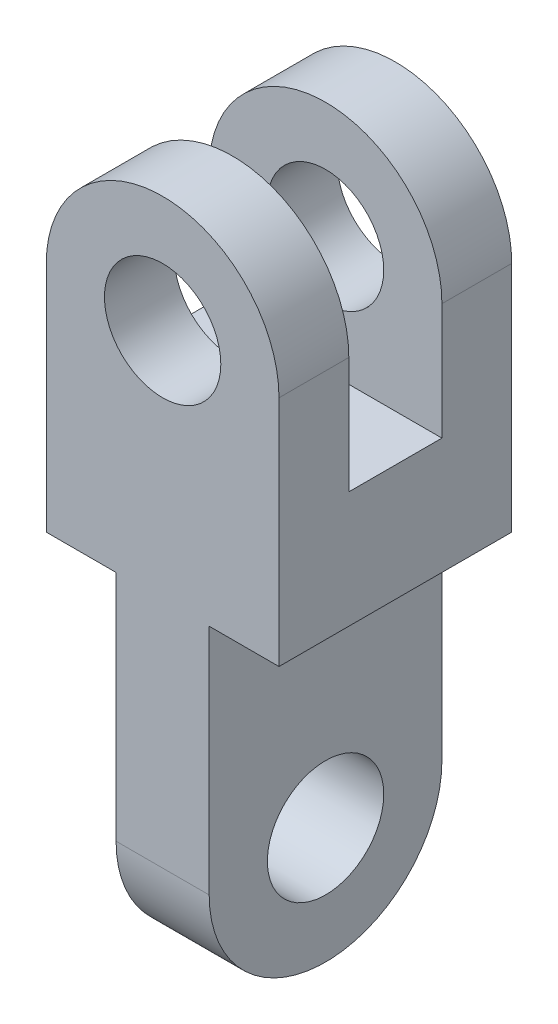
ISO-10303-21;
HEADER;
FILE_DESCRIPTION(('STEP AP214'),'2;1');
FILE_NAME('part.step','',(''),(''),'','','');
FILE_SCHEMA(('AUTOMOTIVE_DESIGN { 1 0 10303 214 1 1 1 1 }'));
ENDSEC;
DATA;
#1=APPLICATION_CONTEXT('core data for automotive mechanical design processes');
#2=APPLICATION_PROTOCOL_DEFINITION('international standard','automotive_design',2000,#1);
#3=PRODUCT_CONTEXT('',#1,'mechanical');
#4=PRODUCT('Part','Part','',(#3));
#5=PRODUCT_RELATED_PRODUCT_CATEGORY('part','',(#4));
#6=PRODUCT_DEFINITION_FORMATION('','',#4);
#7=PRODUCT_DEFINITION_CONTEXT('part definition',#1,'design');
#8=PRODUCT_DEFINITION('design','',#6,#7);
#9=PRODUCT_DEFINITION_SHAPE('','',#8);
#10=(LENGTH_UNIT() NAMED_UNIT(*) SI_UNIT(.MILLI.,.METRE.));
#11=(NAMED_UNIT(*) PLANE_ANGLE_UNIT() SI_UNIT($,.RADIAN.));
#12=(NAMED_UNIT(*) SI_UNIT($,.STERADIAN.) SOLID_ANGLE_UNIT());
#13=UNCERTAINTY_MEASURE_WITH_UNIT(LENGTH_MEASURE(1.E-05),#10,'distance_accuracy_value','');
#14=(GEOMETRIC_REPRESENTATION_CONTEXT(3) GLOBAL_UNCERTAINTY_ASSIGNED_CONTEXT((#13)) GLOBAL_UNIT_ASSIGNED_CONTEXT((#10,
#11,#12)) REPRESENTATION_CONTEXT('',''));
#15=CARTESIAN_POINT('',(0.,0.,0.));
#16=DIRECTION('',(0.,0.,1.));
#17=DIRECTION('',(1.,0.,0.));
#18=AXIS2_PLACEMENT_3D('',#15,#16,#17);
#19=CARTESIAN_POINT('',(40.,-91.739880304679,13.7281963801388));
#20=DIRECTION('',(1.,0.,0.));
#21=DIRECTION('',(0.,0.,-1.));
#22=AXIS2_PLACEMENT_3D('',#19,#20,#21);
#23=PLANE('',#22);
#24=DIRECTION('',(0.,-1.,0.));
#25=VECTOR('',#24,1.);
#26=CARTESIAN_POINT('',(40.,8.26011969532102,63.7281963801388));
#27=LINE('',#26,#25);
#28=CARTESIAN_POINT('',(40.,8.26011969532102,63.7281963801388));
#29=VERTEX_POINT('',#28);
#30=CARTESIAN_POINT('',(40.,-91.739880304679,63.7281963801388));
#31=VERTEX_POINT('',#30);
#32=EDGE_CURVE('E219',#29,#31,#27,.T.);
#33=ORIENTED_EDGE('',*,*,#32,.T.);
#34=CARTESIAN_POINT('',(40.,-91.739880304679,13.7281963801388));
#35=DIRECTION('',(1.,0.,0.));
#36=DIRECTION('',(0.,0.,-1.));
#37=AXIS2_PLACEMENT_3D('',#34,#35,#36);
#38=CIRCLE('',#37,50.);
#39=CARTESIAN_POINT('',(40.,-91.739880304679,-36.2718036198612));
#40=VERTEX_POINT('',#39);
#41=EDGE_CURVE('E222',#31,#40,#38,.T.);
#42=ORIENTED_EDGE('',*,*,#41,.T.);
#43=DIRECTION('',(0.,1.,0.));
#44=VECTOR('',#43,1.);
#45=CARTESIAN_POINT('',(40.,8.26011969532102,-36.2718036198612));
#46=LINE('',#45,#44);
#47=CARTESIAN_POINT('',(40.,8.26011969532102,-36.2718036198612));
#48=VERTEX_POINT('',#47);
#49=EDGE_CURVE('E225',#40,#48,#46,.T.);
#50=ORIENTED_EDGE('',*,*,#49,.T.);
#51=DIRECTION('',(0.,0.,1.));
#52=VECTOR('',#51,1.);
#53=CARTESIAN_POINT('',(40.,8.26011969532102,63.7281963801388));
#54=LINE('',#53,#52);
#55=EDGE_CURVE('E227',#48,#29,#54,.T.);
#56=ORIENTED_EDGE('',*,*,#55,.T.);
#57=EDGE_LOOP('',(#33,#42,#50,#56));
#58=FACE_BOUND('',#57,.T.);
#59=CARTESIAN_POINT('',(40.,-91.739880304679,13.7281963801388));
#60=DIRECTION('',(1.,0.,0.));
#61=DIRECTION('',(0.,0.,-1.));
#62=AXIS2_PLACEMENT_3D('',#59,#60,#61);
#63=CIRCLE('',#62,25.);
#64=CARTESIAN_POINT('',(40.,-91.739880304679,-11.2718036198612));
#65=VERTEX_POINT('',#64);
#66=EDGE_CURVE('E213',#65,#65,#63,.T.);
#67=ORIENTED_EDGE('',*,*,#66,.F.);
#68=EDGE_LOOP('',(#67));
#69=FACE_BOUND('',#68,.T.);
#70=ADVANCED_FACE('F39',(#58,#69),#23,.T.);
#71=CARTESIAN_POINT('',(0.,-91.739880304679,13.7281963801388));
#72=DIRECTION('',(1.,0.,0.));
#73=DIRECTION('',(0.,0.,-1.));
#74=AXIS2_PLACEMENT_3D('',#71,#72,#73);
#75=PLANE('',#74);
#76=DIRECTION('',(0.,-1.,0.));
#77=VECTOR('',#76,1.);
#78=CARTESIAN_POINT('',(0.,8.26011969532102,63.7281963801388));
#79=LINE('',#78,#77);
#80=CARTESIAN_POINT('',(0.,8.26011969532102,63.7281963801388));
#81=VERTEX_POINT('',#80);
#82=CARTESIAN_POINT('',(0.,-91.739880304679,63.7281963801388));
#83=VERTEX_POINT('',#82);
#84=EDGE_CURVE('E216',#81,#83,#79,.T.);
#85=ORIENTED_EDGE('',*,*,#84,.F.);
#86=DIRECTION('',(0.,0.,1.));
#87=VECTOR('',#86,1.);
#88=CARTESIAN_POINT('',(0.,8.26011969532102,63.7281963801388));
#89=LINE('',#88,#87);
#90=CARTESIAN_POINT('',(0.,8.26011969532101,-36.2718036198612));
#91=VERTEX_POINT('',#90);
#92=EDGE_CURVE('E223',#91,#81,#89,.T.);
#93=ORIENTED_EDGE('',*,*,#92,.F.);
#94=DIRECTION('',(0.,1.,0.));
#95=VECTOR('',#94,1.);
#96=CARTESIAN_POINT('',(0.,8.26011969532102,-36.2718036198612));
#97=LINE('',#96,#95);
#98=CARTESIAN_POINT('',(0.,-91.739880304679,-36.2718036198612));
#99=VERTEX_POINT('',#98);
#100=EDGE_CURVE('E233',#99,#91,#97,.T.);
#101=ORIENTED_EDGE('',*,*,#100,.F.);
#102=CARTESIAN_POINT('',(0.,-91.739880304679,13.7281963801388));
#103=DIRECTION('',(1.,0.,0.));
#104=DIRECTION('',(0.,0.,-1.));
#105=AXIS2_PLACEMENT_3D('',#102,#103,#104);
#106=CIRCLE('',#105,50.);
#107=EDGE_CURVE('E231',#83,#99,#106,.T.);
#108=ORIENTED_EDGE('',*,*,#107,.F.);
#109=EDGE_LOOP('',(#85,#93,#101,#108));
#110=FACE_BOUND('',#109,.T.);
#111=CARTESIAN_POINT('',(0.,-91.739880304679,13.7281963801388));
#112=DIRECTION('',(1.,0.,0.));
#113=DIRECTION('',(0.,0.,-1.));
#114=AXIS2_PLACEMENT_3D('',#111,#112,#113);
#115=CIRCLE('',#114,25.);
#116=CARTESIAN_POINT('',(0.,-91.739880304679,-11.2718036198612));
#117=VERTEX_POINT('',#116);
#118=EDGE_CURVE('E206',#117,#117,#115,.T.);
#119=ORIENTED_EDGE('',*,*,#118,.T.);
#120=EDGE_LOOP('',(#119));
#121=FACE_BOUND('',#120,.T.);
#122=ADVANCED_FACE('F248',(#110,#121),#75,.F.);
#123=CARTESIAN_POINT('',(40.,8.26011969532102,63.7281963801388));
#124=DIRECTION('',(0.,0.,-1.));
#125=DIRECTION('',(-1.,0.,0.));
#126=AXIS2_PLACEMENT_3D('',#123,#124,#125);
#127=PLANE('',#126);
#128=ORIENTED_EDGE('',*,*,#84,.T.);
#129=DIRECTION('',(-1.,0.,0.));
#130=VECTOR('',#129,1.);
#131=CARTESIAN_POINT('',(40.,-91.739880304679,63.7281963801388));
#132=LINE('',#131,#130);
#133=EDGE_CURVE('E11',#31,#83,#132,.T.);
#134=ORIENTED_EDGE('',*,*,#133,.F.);
#135=ORIENTED_EDGE('',*,*,#32,.F.);
#136=DIRECTION('',(-1.,0.,0.));
#137=VECTOR('',#136,1.);
#138=CARTESIAN_POINT('',(0.,8.26011969532101,63.7281963801388));
#139=LINE('',#138,#137);
#140=CARTESIAN_POINT('',(70.,8.26011969532101,63.7281963801388));
#141=VERTEX_POINT('',#140);
#142=EDGE_CURVE('E182',#141,#29,#139,.T.);
#143=ORIENTED_EDGE('',*,*,#142,.F.);
#144=DIRECTION('',(0.,1.,0.));
#145=VECTOR('',#144,1.);
#146=CARTESIAN_POINT('',(70.,0.,63.7281963801388));
#147=LINE('',#146,#145);
#148=CARTESIAN_POINT('',(70.,108.260119695321,63.7281963801388));
#149=VERTEX_POINT('',#148);
#150=EDGE_CURVE('E192',#141,#149,#147,.T.);
#151=ORIENTED_EDGE('',*,*,#150,.T.);
#152=CARTESIAN_POINT('',(20.,108.260119695321,63.7281963801388));
#153=DIRECTION('',(0.,0.,1.));
#154=DIRECTION('',(1.,0.,0.));
#155=AXIS2_PLACEMENT_3D('',#152,#153,#154);
#156=CIRCLE('',#155,50.);
#157=CARTESIAN_POINT('',(-30.,108.260119695321,63.7281963801388));
#158=VERTEX_POINT('',#157);
#159=EDGE_CURVE('E195',#149,#158,#156,.T.);
#160=ORIENTED_EDGE('',*,*,#159,.T.);
#161=DIRECTION('',(0.,-1.,0.));
#162=VECTOR('',#161,1.);
#163=CARTESIAN_POINT('',(-30.,0.,63.7281963801388));
#164=LINE('',#163,#162);
#165=CARTESIAN_POINT('',(-30.,8.26011969532101,63.7281963801388));
#166=VERTEX_POINT('',#165);
#167=EDGE_CURVE('E198',#158,#166,#164,.T.);
#168=ORIENTED_EDGE('',*,*,#167,.T.);
#169=EDGE_CURVE('E201',#81,#166,#139,.T.);
#170=ORIENTED_EDGE('',*,*,#169,.F.);
#171=EDGE_LOOP('',(#128,#134,#135,#143,#151,#160,#168,#170));
#172=FACE_BOUND('',#171,.T.);
#173=CARTESIAN_POINT('',(20.,108.260119695321,63.7281963801388));
#174=DIRECTION('',(0.,0.,1.));
#175=DIRECTION('',(1.,0.,0.));
#176=AXIS2_PLACEMENT_3D('',#173,#174,#175);
#177=CIRCLE('',#176,25.);
#178=CARTESIAN_POINT('',(45.,108.260119695321,63.7281963801388));
#179=VERTEX_POINT('',#178);
#180=EDGE_CURVE('E176',#179,#179,#177,.T.);
#181=ORIENTED_EDGE('',*,*,#180,.F.);
#182=EDGE_LOOP('',(#181));
#183=FACE_BOUND('',#182,.T.);
#184=ADVANCED_FACE('F41',(#172,#183),#127,.F.);
#185=CARTESIAN_POINT('',(40.,-91.739880304679,13.7281963801388));
#186=DIRECTION('',(-1.,0.,0.));
#187=DIRECTION('',(0.,0.,1.));
#188=AXIS2_PLACEMENT_3D('',#185,#186,#187);
#189=CYLINDRICAL_SURFACE('',#188,50.);
#190=ORIENTED_EDGE('',*,*,#107,.T.);
#191=DIRECTION('',(-1.,0.,0.));
#192=VECTOR('',#191,1.);
#193=CARTESIAN_POINT('',(40.,-91.739880304679,-36.2718036198612));
#194=LINE('',#193,#192);
#195=EDGE_CURVE('E47',#40,#99,#194,.T.);
#196=ORIENTED_EDGE('',*,*,#195,.F.);
#197=ORIENTED_EDGE('',*,*,#41,.F.);
#198=ORIENTED_EDGE('',*,*,#133,.T.);
#199=EDGE_LOOP('',(#190,#196,#197,#198));
#200=FACE_BOUND('',#199,.T.);
#201=ADVANCED_FACE('F272',(#200),#189,.T.);
#202=CARTESIAN_POINT('',(40.,8.26011969532102,-36.2718036198612));
#203=DIRECTION('',(0.,0.,1.));
#204=DIRECTION('',(0.,-1.,0.));
#205=AXIS2_PLACEMENT_3D('',#202,#203,#204);
#206=PLANE('',#205);
#207=ORIENTED_EDGE('',*,*,#100,.T.);
#208=DIRECTION('',(-1.,0.,0.));
#209=VECTOR('',#208,1.);
#210=CARTESIAN_POINT('',(0.,8.26011969532101,-36.2718036198612));
#211=LINE('',#210,#209);
#212=CARTESIAN_POINT('',(-30.,8.26011969532101,-36.2718036198612));
#213=VERTEX_POINT('',#212);
#214=EDGE_CURVE('E167',#91,#213,#211,.T.);
#215=ORIENTED_EDGE('',*,*,#214,.T.);
#216=DIRECTION('',(0.,-1.,0.));
#217=VECTOR('',#216,1.);
#218=CARTESIAN_POINT('',(-30.,0.,-36.2718036198612));
#219=LINE('',#218,#217);
#220=CARTESIAN_POINT('',(-30.,108.260119695321,-36.2718036198612));
#221=VERTEX_POINT('',#220);
#222=EDGE_CURVE('E171',#221,#213,#219,.T.);
#223=ORIENTED_EDGE('',*,*,#222,.F.);
#224=CARTESIAN_POINT('',(20.,108.260119695321,-36.2718036198612));
#225=DIRECTION('',(0.,0.,1.));
#226=DIRECTION('',(1.,0.,0.));
#227=AXIS2_PLACEMENT_3D('',#224,#225,#226);
#228=CIRCLE('',#227,50.);
#229=CARTESIAN_POINT('',(70.,108.260119695321,-36.2718036198612));
#230=VERTEX_POINT('',#229);
#231=EDGE_CURVE('E157',#230,#221,#228,.T.);
#232=ORIENTED_EDGE('',*,*,#231,.F.);
#233=DIRECTION('',(0.,1.,0.));
#234=VECTOR('',#233,1.);
#235=CARTESIAN_POINT('',(70.,0.,-36.2718036198612));
#236=LINE('',#235,#234);
#237=CARTESIAN_POINT('',(70.,8.26011969532101,-36.2718036198612));
#238=VERTEX_POINT('',#237);
#239=EDGE_CURVE('E165',#238,#230,#236,.T.);
#240=ORIENTED_EDGE('',*,*,#239,.F.);
#241=EDGE_CURVE('E168',#238,#48,#211,.T.);
#242=ORIENTED_EDGE('',*,*,#241,.T.);
#243=ORIENTED_EDGE('',*,*,#49,.F.);
#244=ORIENTED_EDGE('',*,*,#195,.T.);
#245=EDGE_LOOP('',(#207,#215,#223,#232,#240,#242,#243,#244));
#246=FACE_BOUND('',#245,.T.);
#247=CARTESIAN_POINT('',(20.,108.260119695321,-36.2718036198612));
#248=DIRECTION('',(0.,0.,1.));
#249=DIRECTION('',(1.,0.,0.));
#250=AXIS2_PLACEMENT_3D('',#247,#248,#249);
#251=CIRCLE('',#250,25.);
#252=CARTESIAN_POINT('',(45.,108.260119695321,-36.2718036198612));
#253=VERTEX_POINT('',#252);
#254=EDGE_CURVE('E154',#253,#253,#251,.T.);
#255=ORIENTED_EDGE('',*,*,#254,.T.);
#256=EDGE_LOOP('',(#255));
#257=FACE_BOUND('',#256,.T.);
#258=ADVANCED_FACE('F241',(#246,#257),#206,.F.);
#259=CARTESIAN_POINT('',(40.,-91.739880304679,13.7281963801388));
#260=DIRECTION('',(-1.,0.,0.));
#261=DIRECTION('',(0.,0.,1.));
#262=AXIS2_PLACEMENT_3D('',#259,#260,#261);
#263=CYLINDRICAL_SURFACE('',#262,25.);
#264=ORIENTED_EDGE('',*,*,#66,.T.);
#265=EDGE_LOOP('',(#264));
#266=FACE_BOUND('',#265,.T.);
#267=ORIENTED_EDGE('',*,*,#118,.F.);
#268=EDGE_LOOP('',(#267));
#269=FACE_BOUND('',#268,.T.);
#270=ADVANCED_FACE('F278',(#266,#269),#263,.F.);
#271=CARTESIAN_POINT('',(0.,8.26011969532101,33.7281963801388));
#272=DIRECTION('',(0.,1.,0.));
#273=DIRECTION('',(-1.,0.,0.));
#274=AXIS2_PLACEMENT_3D('',#271,#272,#273);
#275=PLANE('',#274);
#276=DIRECTION('',(0.,0.,1.));
#277=VECTOR('',#276,1.);
#278=CARTESIAN_POINT('',(-30.,8.26011969532101,33.7281963801388));
#279=LINE('',#278,#277);
#280=EDGE_CURVE('E207',#213,#166,#279,.T.);
#281=ORIENTED_EDGE('',*,*,#280,.F.);
#282=ORIENTED_EDGE('',*,*,#214,.F.);
#283=ORIENTED_EDGE('',*,*,#92,.T.);
#284=ORIENTED_EDGE('',*,*,#169,.T.);
#285=EDGE_LOOP('',(#281,#282,#283,#284));
#286=FACE_BOUND('',#285,.T.);
#287=ADVANCED_FACE('F252',(#286),#275,.F.);
#288=CARTESIAN_POINT('',(70.,0.,33.7281963801388));
#289=DIRECTION('',(1.,0.,0.));
#290=DIRECTION('',(0.,0.,-1.));
#291=AXIS2_PLACEMENT_3D('',#288,#289,#290);
#292=PLANE('',#291);
#293=ORIENTED_EDGE('',*,*,#150,.F.);
#294=DIRECTION('',(0.,0.,1.));
#295=VECTOR('',#294,1.);
#296=CARTESIAN_POINT('',(70.,8.26011969532101,33.7281963801388));
#297=LINE('',#296,#295);
#298=EDGE_CURVE('E204',#238,#141,#297,.T.);
#299=ORIENTED_EDGE('',*,*,#298,.F.);
#300=ORIENTED_EDGE('',*,*,#239,.T.);
#301=DIRECTION('',(0.,0.,-1.));
#302=VECTOR('',#301,1.);
#303=CARTESIAN_POINT('',(70.,108.260119695321,-6.27180361986121));
#304=LINE('',#303,#302);
#305=CARTESIAN_POINT('',(70.,108.260119695321,-6.27180361986121));
#306=VERTEX_POINT('',#305);
#307=EDGE_CURVE('E135',#306,#230,#304,.T.);
#308=ORIENTED_EDGE('',*,*,#307,.F.);
#309=DIRECTION('',(0.,1.,0.));
#310=VECTOR('',#309,1.);
#311=CARTESIAN_POINT('',(70.,0.,-6.27180361986121));
#312=LINE('',#311,#310);
#313=CARTESIAN_POINT('',(70.,58.260119695321,-6.27180361986121));
#314=VERTEX_POINT('',#313);
#315=EDGE_CURVE('E127',#314,#306,#312,.T.);
#316=ORIENTED_EDGE('',*,*,#315,.F.);
#317=DIRECTION('',(0.,0.,1.));
#318=VECTOR('',#317,1.);
#319=CARTESIAN_POINT('',(70.,58.260119695321,33.7281963801388));
#320=LINE('',#319,#318);
#321=CARTESIAN_POINT('',(70.,58.260119695321,33.7281963801388));
#322=VERTEX_POINT('',#321);
#323=EDGE_CURVE('E132',#314,#322,#320,.T.);
#324=ORIENTED_EDGE('',*,*,#323,.T.);
#325=DIRECTION('',(0.,1.,0.));
#326=VECTOR('',#325,1.);
#327=CARTESIAN_POINT('',(70.,0.,33.7281963801388));
#328=LINE('',#327,#326);
#329=CARTESIAN_POINT('',(70.,108.260119695321,33.7281963801388));
#330=VERTEX_POINT('',#329);
#331=EDGE_CURVE('E59',#322,#330,#328,.T.);
#332=ORIENTED_EDGE('',*,*,#331,.T.);
#333=DIRECTION('',(0.,0.,1.));
#334=VECTOR('',#333,1.);
#335=CARTESIAN_POINT('',(70.,108.260119695321,33.7281963801388));
#336=LINE('',#335,#334);
#337=EDGE_CURVE('E189',#330,#149,#336,.T.);
#338=ORIENTED_EDGE('',*,*,#337,.T.);
#339=EDGE_LOOP('',(#293,#299,#300,#308,#316,#324,#332,#338));
#340=FACE_BOUND('',#339,.T.);
#341=ADVANCED_FACE('F130',(#340),#292,.T.);
#342=ORIENTED_EDGE('',*,*,#142,.T.);
#343=ORIENTED_EDGE('',*,*,#55,.F.);
#344=ORIENTED_EDGE('',*,*,#241,.F.);
#345=ORIENTED_EDGE('',*,*,#298,.T.);
#346=EDGE_LOOP('',(#342,#343,#344,#345));
#347=FACE_BOUND('',#346,.T.);
#348=ADVANCED_FACE('F264',(#347),#275,.F.);
#349=CARTESIAN_POINT('',(-30.,0.,33.7281963801388));
#350=DIRECTION('',(-1.,0.,0.));
#351=DIRECTION('',(0.,0.,1.));
#352=AXIS2_PLACEMENT_3D('',#349,#350,#351);
#353=PLANE('',#352);
#354=ORIENTED_EDGE('',*,*,#167,.F.);
#355=DIRECTION('',(0.,0.,1.));
#356=VECTOR('',#355,1.);
#357=CARTESIAN_POINT('',(-30.,108.260119695321,33.7281963801388));
#358=LINE('',#357,#356);
#359=CARTESIAN_POINT('',(-30.,108.260119695321,33.7281963801388));
#360=VERTEX_POINT('',#359);
#361=EDGE_CURVE('E210',#360,#158,#358,.T.);
#362=ORIENTED_EDGE('',*,*,#361,.F.);
#363=DIRECTION('',(0.,-1.,0.));
#364=VECTOR('',#363,1.);
#365=CARTESIAN_POINT('',(-30.,0.,33.7281963801388));
#366=LINE('',#365,#364);
#367=CARTESIAN_POINT('',(-30.,58.260119695321,33.7281963801388));
#368=VERTEX_POINT('',#367);
#369=EDGE_CURVE('E187',#360,#368,#366,.T.);
#370=ORIENTED_EDGE('',*,*,#369,.T.);
#371=DIRECTION('',(0.,0.,1.));
#372=VECTOR('',#371,1.);
#373=CARTESIAN_POINT('',(-30.,58.260119695321,33.7281963801388));
#374=LINE('',#373,#372);
#375=CARTESIAN_POINT('',(-30.,58.260119695321,-6.27180361986121));
#376=VERTEX_POINT('',#375);
#377=EDGE_CURVE('E148',#376,#368,#374,.T.);
#378=ORIENTED_EDGE('',*,*,#377,.F.);
#379=DIRECTION('',(0.,-1.,0.));
#380=VECTOR('',#379,1.);
#381=CARTESIAN_POINT('',(-30.,0.,-6.27180361986121));
#382=LINE('',#381,#380);
#383=CARTESIAN_POINT('',(-30.,108.260119695321,-6.27180361986121));
#384=VERTEX_POINT('',#383);
#385=EDGE_CURVE('E138',#384,#376,#382,.T.);
#386=ORIENTED_EDGE('',*,*,#385,.F.);
#387=DIRECTION('',(0.,0.,-1.));
#388=VECTOR('',#387,1.);
#389=CARTESIAN_POINT('',(-30.,108.260119695321,-6.27180361986121));
#390=LINE('',#389,#388);
#391=EDGE_CURVE('E162',#384,#221,#390,.T.);
#392=ORIENTED_EDGE('',*,*,#391,.T.);
#393=ORIENTED_EDGE('',*,*,#222,.T.);
#394=ORIENTED_EDGE('',*,*,#280,.T.);
#395=EDGE_LOOP('',(#354,#362,#370,#378,#386,#392,#393,#394));
#396=FACE_BOUND('',#395,.T.);
#397=ADVANCED_FACE('F256',(#396),#353,.T.);
#398=CARTESIAN_POINT('',(20.,108.260119695321,33.7281963801388));
#399=DIRECTION('',(0.,0.,1.));
#400=DIRECTION('',(1.,0.,0.));
#401=AXIS2_PLACEMENT_3D('',#398,#399,#400);
#402=CYLINDRICAL_SURFACE('',#401,25.);
#403=CARTESIAN_POINT('',(20.,108.260119695321,33.7281963801388));
#404=DIRECTION('',(0.,0.,1.));
#405=DIRECTION('',(1.,0.,0.));
#406=AXIS2_PLACEMENT_3D('',#403,#404,#405);
#407=CIRCLE('',#406,25.);
#408=CARTESIAN_POINT('',(45.,108.260119695321,33.7281963801388));
#409=VERTEX_POINT('',#408);
#410=EDGE_CURVE('E179',#409,#409,#407,.T.);
#411=ORIENTED_EDGE('',*,*,#410,.F.);
#412=EDGE_LOOP('',(#411));
#413=FACE_BOUND('',#412,.T.);
#414=ORIENTED_EDGE('',*,*,#180,.T.);
#415=EDGE_LOOP('',(#414));
#416=FACE_BOUND('',#415,.T.);
#417=ADVANCED_FACE('F290',(#413,#416),#402,.F.);
#418=CARTESIAN_POINT('',(20.,108.260119695321,33.7281963801388));
#419=DIRECTION('',(0.,0.,1.));
#420=DIRECTION('',(1.,0.,0.));
#421=AXIS2_PLACEMENT_3D('',#418,#419,#420);
#422=CYLINDRICAL_SURFACE('',#421,50.);
#423=ORIENTED_EDGE('',*,*,#159,.F.);
#424=ORIENTED_EDGE('',*,*,#337,.F.);
#425=CARTESIAN_POINT('',(20.,108.260119695321,33.7281963801388));
#426=DIRECTION('',(0.,0.,1.));
#427=DIRECTION('',(1.,0.,0.));
#428=AXIS2_PLACEMENT_3D('',#425,#426,#427);
#429=CIRCLE('',#428,50.);
#430=EDGE_CURVE('E184',#330,#360,#429,.T.);
#431=ORIENTED_EDGE('',*,*,#430,.T.);
#432=ORIENTED_EDGE('',*,*,#361,.T.);
#433=EDGE_LOOP('',(#423,#424,#431,#432));
#434=FACE_BOUND('',#433,.T.);
#435=ADVANCED_FACE('F293',(#434),#422,.T.);
#436=CARTESIAN_POINT('',(0.,0.,33.7281963801388));
#437=DIRECTION('',(0.,0.,1.));
#438=DIRECTION('',(1.,0.,0.));
#439=AXIS2_PLACEMENT_3D('',#436,#437,#438);
#440=PLANE('',#439);
#441=ORIENTED_EDGE('',*,*,#410,.T.);
#442=EDGE_LOOP('',(#441));
#443=FACE_BOUND('',#442,.T.);
#444=ORIENTED_EDGE('',*,*,#331,.F.);
#445=DIRECTION('',(1.,0.,0.));
#446=VECTOR('',#445,1.);
#447=CARTESIAN_POINT('',(-30.,58.260119695321,33.7281963801388));
#448=LINE('',#447,#446);
#449=EDGE_CURVE('E54',#368,#322,#448,.T.);
#450=ORIENTED_EDGE('',*,*,#449,.F.);
#451=ORIENTED_EDGE('',*,*,#369,.F.);
#452=ORIENTED_EDGE('',*,*,#430,.F.);
#453=EDGE_LOOP('',(#444,#450,#451,#452));
#454=FACE_BOUND('',#453,.T.);
#455=ADVANCED_FACE('F299',(#443,#454),#440,.F.);
#456=CARTESIAN_POINT('',(20.,108.260119695321,-6.27180361986121));
#457=DIRECTION('',(0.,0.,-1.));
#458=DIRECTION('',(-1.,0.,0.));
#459=AXIS2_PLACEMENT_3D('',#456,#457,#458);
#460=CYLINDRICAL_SURFACE('',#459,50.);
#461=ORIENTED_EDGE('',*,*,#231,.T.);
#462=ORIENTED_EDGE('',*,*,#391,.F.);
#463=CARTESIAN_POINT('',(20.,108.260119695321,-6.27180361986121));
#464=DIRECTION('',(0.,0.,1.));
#465=DIRECTION('',(1.,0.,0.));
#466=AXIS2_PLACEMENT_3D('',#463,#464,#465);
#467=CIRCLE('',#466,50.);
#468=EDGE_CURVE('E160',#306,#384,#467,.T.);
#469=ORIENTED_EDGE('',*,*,#468,.F.);
#470=ORIENTED_EDGE('',*,*,#307,.T.);
#471=EDGE_LOOP('',(#461,#462,#469,#470));
#472=FACE_BOUND('',#471,.T.);
#473=ADVANCED_FACE('F259',(#472),#460,.T.);
#474=CARTESIAN_POINT('',(20.,108.260119695321,-6.27180361986121));
#475=DIRECTION('',(0.,0.,-1.));
#476=DIRECTION('',(-1.,0.,0.));
#477=AXIS2_PLACEMENT_3D('',#474,#475,#476);
#478=CYLINDRICAL_SURFACE('',#477,25.);
#479=CARTESIAN_POINT('',(20.,108.260119695321,-6.27180361986121));
#480=DIRECTION('',(0.,0.,1.));
#481=DIRECTION('',(1.,0.,0.));
#482=AXIS2_PLACEMENT_3D('',#479,#480,#481);
#483=CIRCLE('',#482,25.);
#484=CARTESIAN_POINT('',(45.,108.260119695321,-6.27180361986121));
#485=VERTEX_POINT('',#484);
#486=EDGE_CURVE('E139',#485,#485,#483,.T.);
#487=ORIENTED_EDGE('',*,*,#486,.T.);
#488=EDGE_LOOP('',(#487));
#489=FACE_BOUND('',#488,.T.);
#490=ORIENTED_EDGE('',*,*,#254,.F.);
#491=EDGE_LOOP('',(#490));
#492=FACE_BOUND('',#491,.T.);
#493=ADVANCED_FACE('F308',(#489,#492),#478,.F.);
#494=CARTESIAN_POINT('',(0.,0.,-6.27180361986121));
#495=DIRECTION('',(0.,0.,-1.));
#496=DIRECTION('',(1.,0.,0.));
#497=AXIS2_PLACEMENT_3D('',#494,#495,#496);
#498=PLANE('',#497);
#499=ORIENTED_EDGE('',*,*,#486,.F.);
#500=EDGE_LOOP('',(#499));
#501=FACE_BOUND('',#500,.T.);
#502=ORIENTED_EDGE('',*,*,#385,.T.);
#503=DIRECTION('',(1.,0.,0.));
#504=VECTOR('',#503,1.);
#505=CARTESIAN_POINT('',(-30.,58.260119695321,-6.27180361986121));
#506=LINE('',#505,#504);
#507=EDGE_CURVE('E142',#376,#314,#506,.T.);
#508=ORIENTED_EDGE('',*,*,#507,.T.);
#509=ORIENTED_EDGE('',*,*,#315,.T.);
#510=ORIENTED_EDGE('',*,*,#468,.T.);
#511=EDGE_LOOP('',(#502,#508,#509,#510));
#512=FACE_BOUND('',#511,.T.);
#513=ADVANCED_FACE('F143',(#501,#512),#498,.F.);
#514=CARTESIAN_POINT('',(-30.,58.260119695321,33.7281963801388));
#515=DIRECTION('',(0.,1.,0.));
#516=DIRECTION('',(0.,0.,1.));
#517=AXIS2_PLACEMENT_3D('',#514,#515,#516);
#518=PLANE('',#517);
#519=ORIENTED_EDGE('',*,*,#323,.F.);
#520=ORIENTED_EDGE('',*,*,#507,.F.);
#521=ORIENTED_EDGE('',*,*,#377,.T.);
#522=ORIENTED_EDGE('',*,*,#449,.T.);
#523=EDGE_LOOP('',(#519,#520,#521,#522));
#524=FACE_BOUND('',#523,.T.);
#525=ADVANCED_FACE('F150',(#524),#518,.T.);
#526=CLOSED_SHELL('',(#70,#122,#184,#201,#258,#270,#287,#341,#348,#397,#417,#435,#455,#473,#493,
#513,#525));
#527=MANIFOLD_SOLID_BREP('B2',#526);
#528=ADVANCED_BREP_SHAPE_REPRESENTATION('',(#18,#527),#14);
#529=SHAPE_DEFINITION_REPRESENTATION(#9,#528);
ENDSEC;
END-ISO-10303-21;
